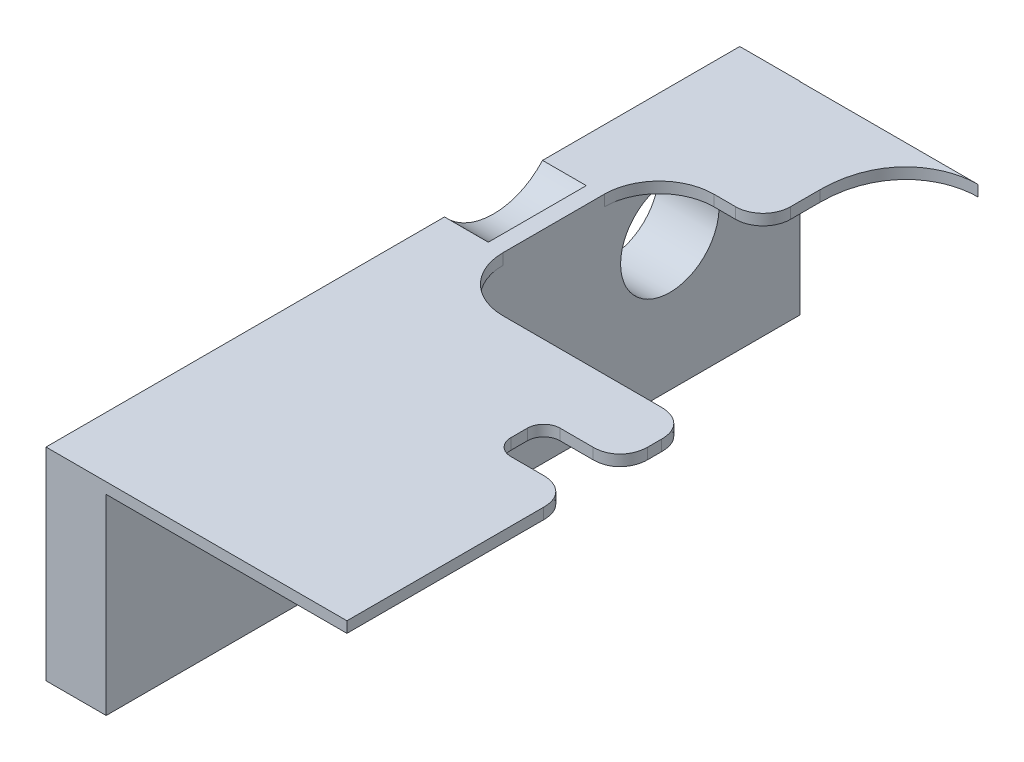
ISO-10303-21;
HEADER;
FILE_DESCRIPTION(('STEP AP214'),'2;1');
FILE_NAME('part.step','',(''),(''),'','','');
FILE_SCHEMA(('AUTOMOTIVE_DESIGN { 1 0 10303 214 1 1 1 1 }'));
ENDSEC;
DATA;
#1=APPLICATION_CONTEXT('core data for automotive mechanical design processes');
#2=APPLICATION_PROTOCOL_DEFINITION('international standard','automotive_design',2000,#1);
#3=PRODUCT_CONTEXT('',#1,'mechanical');
#4=PRODUCT('Part','Part','',(#3));
#5=PRODUCT_RELATED_PRODUCT_CATEGORY('part','',(#4));
#6=PRODUCT_DEFINITION_FORMATION('','',#4);
#7=PRODUCT_DEFINITION_CONTEXT('part definition',#1,'design');
#8=PRODUCT_DEFINITION('design','',#6,#7);
#9=PRODUCT_DEFINITION_SHAPE('','',#8);
#10=(LENGTH_UNIT() NAMED_UNIT(*) SI_UNIT(.MILLI.,.METRE.));
#11=(NAMED_UNIT(*) PLANE_ANGLE_UNIT() SI_UNIT($,.RADIAN.));
#12=(NAMED_UNIT(*) SI_UNIT($,.STERADIAN.) SOLID_ANGLE_UNIT());
#13=UNCERTAINTY_MEASURE_WITH_UNIT(LENGTH_MEASURE(1.E-05),#10,'distance_accuracy_value','');
#14=(GEOMETRIC_REPRESENTATION_CONTEXT(3) GLOBAL_UNCERTAINTY_ASSIGNED_CONTEXT((#13)) GLOBAL_UNIT_ASSIGNED_CONTEXT((#10,
#11,#12)) REPRESENTATION_CONTEXT('',''));
#15=CARTESIAN_POINT('',(0.,0.,0.));
#16=DIRECTION('',(0.,0.,1.));
#17=DIRECTION('',(1.,0.,0.));
#18=AXIS2_PLACEMENT_3D('',#15,#16,#17);
#19=CARTESIAN_POINT('',(8.5,0.,0.));
#20=DIRECTION('',(1.,0.,0.));
#21=DIRECTION('',(0.,0.,1.));
#22=AXIS2_PLACEMENT_3D('',#19,#20,#21);
#23=PLANE('',#22);
#24=DIRECTION('',(0.,0.,1.));
#25=VECTOR('',#24,1.);
#26=CARTESIAN_POINT('',(8.5,-28.5,0.));
#27=LINE('',#26,#25);
#28=CARTESIAN_POINT('',(8.5,-28.5,24.2019318721898));
#29=VERTEX_POINT('',#28);
#30=CARTESIAN_POINT('',(8.5,-28.5,26.7691840241398));
#31=VERTEX_POINT('',#30);
#32=EDGE_CURVE('E301',#29,#31,#27,.T.);
#33=ORIENTED_EDGE('',*,*,#32,.F.);
#34=DIRECTION('',(0.,1.,0.));
#35=VECTOR('',#34,1.);
#36=CARTESIAN_POINT('',(8.5,-36.5,24.2019318721898));
#37=LINE('',#36,#35);
#38=CARTESIAN_POINT('',(8.5,-26.5,24.2019318721898));
#39=VERTEX_POINT('',#38);
#40=EDGE_CURVE('E222',#29,#39,#37,.T.);
#41=ORIENTED_EDGE('',*,*,#40,.T.);
#42=DIRECTION('',(0.,0.,1.));
#43=VECTOR('',#42,1.);
#44=CARTESIAN_POINT('',(8.5,-26.5,-66.7628469614296));
#45=LINE('',#44,#43);
#46=CARTESIAN_POINT('',(8.5,-26.5,26.7691840241398));
#47=VERTEX_POINT('',#46);
#48=EDGE_CURVE('E221',#39,#47,#45,.T.);
#49=ORIENTED_EDGE('',*,*,#48,.T.);
#50=DIRECTION('',(0.,1.,0.));
#51=VECTOR('',#50,1.);
#52=CARTESIAN_POINT('',(8.5,-36.5,26.7691840241398));
#53=LINE('',#52,#51);
#54=EDGE_CURVE('E554',#31,#47,#53,.T.);
#55=ORIENTED_EDGE('',*,*,#54,.F.);
#56=EDGE_LOOP('',(#33,#41,#49,#55));
#57=FACE_BOUND('',#56,.T.);
#58=ADVANCED_FACE('F39',(#57),#23,.T.);
#59=CARTESIAN_POINT('',(-35.5,-36.5,19.2019318721898));
#60=DIRECTION('',(0.,0.,1.));
#61=DIRECTION('',(1.,0.,0.));
#62=AXIS2_PLACEMENT_3D('',#59,#60,#61);
#63=PLANE('',#62);
#64=DIRECTION('',(0.,1.,0.));
#65=VECTOR('',#64,1.);
#66=CARTESIAN_POINT('',(3.5,-36.5,19.2019318721898));
#67=LINE('',#66,#65);
#68=CARTESIAN_POINT('',(3.5,-28.5,19.2019318721898));
#69=VERTEX_POINT('',#68);
#70=CARTESIAN_POINT('',(3.5,-26.5,19.2019318721898));
#71=VERTEX_POINT('',#70);
#72=EDGE_CURVE('E11',#69,#71,#67,.T.);
#73=ORIENTED_EDGE('',*,*,#72,.F.);
#74=DIRECTION('',(-1.,0.,0.));
#75=VECTOR('',#74,1.);
#76=CARTESIAN_POINT('',(17.,-28.5,19.2019318721898));
#77=LINE('',#76,#75);
#78=CARTESIAN_POINT('',(-25.5,-28.5,19.2019318721898));
#79=VERTEX_POINT('',#78);
#80=EDGE_CURVE('E229',#69,#79,#77,.T.);
#81=ORIENTED_EDGE('',*,*,#80,.T.);
#82=DIRECTION('',(0.,1.,0.));
#83=VECTOR('',#82,1.);
#84=CARTESIAN_POINT('',(-25.5,-26.5,19.2019318721898));
#85=LINE('',#84,#83);
#86=CARTESIAN_POINT('',(-25.5,-26.5,19.2019318721898));
#87=VERTEX_POINT('',#86);
#88=EDGE_CURVE('E228',#79,#87,#85,.T.);
#89=ORIENTED_EDGE('',*,*,#88,.T.);
#90=DIRECTION('',(1.,0.,0.));
#91=VECTOR('',#90,1.);
#92=CARTESIAN_POINT('',(-35.5,-26.5,19.2019318721898));
#93=LINE('',#92,#91);
#94=EDGE_CURVE('E220',#87,#71,#93,.T.);
#95=ORIENTED_EDGE('',*,*,#94,.T.);
#96=EDGE_LOOP('',(#73,#81,#89,#95));
#97=FACE_BOUND('',#96,.T.);
#98=ADVANCED_FACE('F226',(#97),#63,.F.);
#99=CARTESIAN_POINT('',(17.,-28.5,40.7691840241398));
#100=DIRECTION('',(0.,0.,1.));
#101=DIRECTION('',(-1.,0.,0.));
#102=AXIS2_PLACEMENT_3D('',#99,#100,#101);
#103=PLANE('',#102);
#104=DIRECTION('',(0.,1.,0.));
#105=VECTOR('',#104,1.);
#106=CARTESIAN_POINT('',(3.5,-36.5,40.7691840241398));
#107=LINE('',#106,#105);
#108=CARTESIAN_POINT('',(3.5,-28.5,40.7691840241398));
#109=VERTEX_POINT('',#108);
#110=CARTESIAN_POINT('',(3.5,-26.5,40.7691840241398));
#111=VERTEX_POINT('',#110);
#112=EDGE_CURVE('E368',#109,#111,#107,.T.);
#113=ORIENTED_EDGE('',*,*,#112,.F.);
#114=DIRECTION('',(-1.,0.,0.));
#115=VECTOR('',#114,1.);
#116=CARTESIAN_POINT('',(17.,-28.5,40.7691840241398));
#117=LINE('',#116,#115);
#118=CARTESIAN_POINT('',(-2.49999999999998,-28.5,40.7691840241398));
#119=VERTEX_POINT('',#118);
#120=EDGE_CURVE('E296',#109,#119,#117,.T.);
#121=ORIENTED_EDGE('',*,*,#120,.T.);
#122=DIRECTION('',(0.,1.,0.));
#123=VECTOR('',#122,1.);
#124=CARTESIAN_POINT('',(-2.49999999999998,-36.5,40.7691840241398));
#125=LINE('',#124,#123);
#126=CARTESIAN_POINT('',(-2.49999999999998,-26.5,40.7691840241398));
#127=VERTEX_POINT('',#126);
#128=EDGE_CURVE('E376',#119,#127,#125,.T.);
#129=ORIENTED_EDGE('',*,*,#128,.T.);
#130=DIRECTION('',(-1.,0.,0.));
#131=VECTOR('',#130,1.);
#132=CARTESIAN_POINT('',(17.,-26.5,40.7691840241398));
#133=LINE('',#132,#131);
#134=EDGE_CURVE('E260',#111,#127,#133,.T.);
#135=ORIENTED_EDGE('',*,*,#134,.F.);
#136=EDGE_LOOP('',(#113,#121,#129,#135));
#137=FACE_BOUND('',#136,.T.);
#138=ADVANCED_FACE('F446',(#137),#103,.F.);
#139=DIRECTION('',(0.,0.,-1.));
#140=VECTOR('',#139,1.);
#141=CARTESIAN_POINT('',(8.5,-28.5,0.));
#142=LINE('',#141,#140);
#143=CARTESIAN_POINT('',(8.5,-28.5,81.7371530385704));
#144=VERTEX_POINT('',#143);
#145=CARTESIAN_POINT('',(8.5,-28.5,45.7691840241398));
#146=VERTEX_POINT('',#145);
#147=EDGE_CURVE('E300',#144,#146,#142,.T.);
#148=ORIENTED_EDGE('',*,*,#147,.T.);
#149=DIRECTION('',(0.,1.,0.));
#150=VECTOR('',#149,1.);
#151=CARTESIAN_POINT('',(8.5,-36.5,45.7691840241398));
#152=LINE('',#151,#150);
#153=CARTESIAN_POINT('',(8.5,-26.5,45.7691840241398));
#154=VERTEX_POINT('',#153);
#155=EDGE_CURVE('E346',#146,#154,#152,.T.);
#156=ORIENTED_EDGE('',*,*,#155,.T.);
#157=CARTESIAN_POINT('',(8.5,-26.5,81.7371530385704));
#158=VERTEX_POINT('',#157);
#159=EDGE_CURVE('E246',#154,#158,#45,.T.);
#160=ORIENTED_EDGE('',*,*,#159,.T.);
#161=DIRECTION('',(0.,1.,0.));
#162=VECTOR('',#161,1.);
#163=CARTESIAN_POINT('',(8.5,-28.5,81.7371530385704));
#164=LINE('',#163,#162);
#165=EDGE_CURVE('E290',#144,#158,#164,.T.);
#166=ORIENTED_EDGE('',*,*,#165,.F.);
#167=EDGE_LOOP('',(#148,#156,#160,#166));
#168=FACE_BOUND('',#167,.T.);
#169=ADVANCED_FACE('F476',(#168),#23,.T.);
#170=CARTESIAN_POINT('',(17.,-28.5,0.));
#171=DIRECTION('',(0.,-1.,0.));
#172=DIRECTION('',(0.,0.,-1.));
#173=AXIS2_PLACEMENT_3D('',#170,#171,#172);
#174=PLANE('',#173);
#175=DIRECTION('',(0.,0.,-1.));
#176=VECTOR('',#175,1.);
#177=CARTESIAN_POINT('',(-16.5,-28.5,0.));
#178=LINE('',#177,#176);
#179=CARTESIAN_POINT('',(-16.5,-28.5,-24.3207797696685));
#180=VERTEX_POINT('',#179);
#181=CARTESIAN_POINT('',(-16.5,-28.5,-29.748719430866));
#182=VERTEX_POINT('',#181);
#183=EDGE_CURVE('E509',#180,#182,#178,.T.);
#184=ORIENTED_EDGE('',*,*,#183,.F.);
#185=CARTESIAN_POINT('',(-21.5,-28.5,-24.3207797696685));
#186=DIRECTION('',(0.,-1.,0.));
#187=DIRECTION('',(0.,0.,-1.));
#188=AXIS2_PLACEMENT_3D('',#185,#186,#187);
#189=CIRCLE('',#188,5.);
#190=CARTESIAN_POINT('',(-21.5,-28.5,-19.3207797696685));
#191=VERTEX_POINT('',#190);
#192=EDGE_CURVE('E507',#180,#191,#189,.T.);
#193=ORIENTED_EDGE('',*,*,#192,.T.);
#194=DIRECTION('',(1.,0.,0.));
#195=VECTOR('',#194,1.);
#196=CARTESIAN_POINT('',(17.,-28.5,-19.3207797696685));
#197=LINE('',#196,#195);
#198=CARTESIAN_POINT('',(-25.5,-28.5,-19.3207797696685));
#199=VERTEX_POINT('',#198);
#200=EDGE_CURVE('E230',#199,#191,#197,.T.);
#201=ORIENTED_EDGE('',*,*,#200,.F.);
#202=CARTESIAN_POINT('',(-25.5,-28.5,-9.32077976966851));
#203=DIRECTION('',(0.,-1.,0.));
#204=DIRECTION('',(0.,0.,-1.));
#205=AXIS2_PLACEMENT_3D('',#202,#203,#204);
#206=CIRCLE('',#205,10.);
#207=CARTESIAN_POINT('',(-35.5,-28.5,-9.32077976966851));
#208=VERTEX_POINT('',#207);
#209=EDGE_CURVE('E324',#199,#208,#206,.F.);
#210=ORIENTED_EDGE('',*,*,#209,.T.);
#211=DIRECTION('',(0.,0.,1.));
#212=VECTOR('',#211,1.);
#213=CARTESIAN_POINT('',(-35.5,-28.5,0.));
#214=LINE('',#213,#212);
#215=CARTESIAN_POINT('',(-35.5,-28.5,-45.));
#216=VERTEX_POINT('',#215);
#217=EDGE_CURVE('E305',#216,#208,#214,.T.);
#218=ORIENTED_EDGE('',*,*,#217,.F.);
#219=DIRECTION('',(1.,0.,0.));
#220=VECTOR('',#219,1.);
#221=CARTESIAN_POINT('',(-40.5,-28.5,-45.));
#222=LINE('',#221,#220);
#223=CARTESIAN_POINT('',(-2.8977037007898,-28.5,-45.));
#224=VERTEX_POINT('',#223);
#225=EDGE_CURVE('E303',#216,#224,#222,.T.);
#226=ORIENTED_EDGE('',*,*,#225,.T.);
#227=CARTESIAN_POINT('',(-16.5,-28.5,-29.748719430866));
#228=CARTESIAN_POINT('',(-16.5,-28.5,-40.0139435271604));
#229=CARTESIAN_POINT('',(-9.64753419036475,-28.5,-45.));
#230=CARTESIAN_POINT('',(-2.8977037007898,-28.5,-45.));
#231=B_SPLINE_CURVE_WITH_KNOTS('',3,(#227,#228,#229,#230),.UNSPECIFIED.,.F.,.F.,(4,4),(0.,1.),.UNSPECIFIED.);
#232=EDGE_CURVE('E389',#182,#224,#231,.T.);
#233=ORIENTED_EDGE('',*,*,#232,.F.);
#234=EDGE_LOOP('',(#184,#193,#201,#210,#218,#226,#233));
#235=FACE_BOUND('',#234,.T.);
#236=ADVANCED_FACE('F453',(#235),#174,.T.);
#237=CARTESIAN_POINT('',(8.5,-26.5,-66.7628469614296));
#238=DIRECTION('',(0.,-1.,0.));
#239=DIRECTION('',(0.,0.,-1.));
#240=AXIS2_PLACEMENT_3D('',#237,#238,#239);
#241=PLANE('',#240);
#242=ORIENTED_EDGE('',*,*,#48,.F.);
#243=CARTESIAN_POINT('',(3.5,-26.5,19.2019318721898));
#244=CARTESIAN_POINT('',(5.85702260395516,-26.5,19.2019318721898));
#245=CARTESIAN_POINT('',(8.50000000000001,-26.5,20.7285626503232));
#246=CARTESIAN_POINT('',(8.5,-26.5,24.2019318721898));
#247=B_SPLINE_CURVE_WITH_KNOTS('',3,(#243,#244,#245,#246),.UNSPECIFIED.,.F.,.F.,(4,4),(0.,1.),.UNSPECIFIED.);
#248=EDGE_CURVE('E211',#71,#39,#247,.T.);
#249=ORIENTED_EDGE('',*,*,#248,.F.);
#250=ORIENTED_EDGE('',*,*,#94,.F.);
#251=CARTESIAN_POINT('',(-25.5,-26.5,9.2019318721898));
#252=DIRECTION('',(0.,-1.,0.));
#253=DIRECTION('',(0.,0.,-1.));
#254=AXIS2_PLACEMENT_3D('',#251,#252,#253);
#255=CIRCLE('',#254,10.);
#256=CARTESIAN_POINT('',(-35.5,-26.5,9.2019318721898));
#257=VERTEX_POINT('',#256);
#258=EDGE_CURVE('E311',#87,#257,#255,.T.);
#259=ORIENTED_EDGE('',*,*,#258,.T.);
#260=DIRECTION('',(0.,0.,-1.));
#261=VECTOR('',#260,1.);
#262=CARTESIAN_POINT('',(-35.5,-26.5,5.));
#263=LINE('',#262,#261);
#264=CARTESIAN_POINT('',(-35.5,-26.5,-9.32077976966851));
#265=VERTEX_POINT('',#264);
#266=EDGE_CURVE('E251',#257,#265,#263,.T.);
#267=ORIENTED_EDGE('',*,*,#266,.T.);
#268=CARTESIAN_POINT('',(-25.5,-26.5,-9.32077976966851));
#269=DIRECTION('',(0.,-1.,0.));
#270=DIRECTION('',(0.,0.,-1.));
#271=AXIS2_PLACEMENT_3D('',#268,#269,#270);
#272=CIRCLE('',#271,10.);
#273=CARTESIAN_POINT('',(-25.5,-26.5,-19.3207797696685));
#274=VERTEX_POINT('',#273);
#275=EDGE_CURVE('E321',#265,#274,#272,.T.);
#276=ORIENTED_EDGE('',*,*,#275,.T.);
#277=DIRECTION('',(-1.,0.,0.));
#278=VECTOR('',#277,1.);
#279=CARTESIAN_POINT('',(1.5,-26.5,-19.3207797696685));
#280=LINE('',#279,#278);
#281=CARTESIAN_POINT('',(-21.5,-26.5,-19.3207797696685));
#282=VERTEX_POINT('',#281);
#283=EDGE_CURVE('E235',#282,#274,#280,.T.);
#284=ORIENTED_EDGE('',*,*,#283,.F.);
#285=CARTESIAN_POINT('',(-21.5,-26.5,-24.3207797696685));
#286=DIRECTION('',(0.,1.,0.));
#287=DIRECTION('',(0.,0.,1.));
#288=AXIS2_PLACEMENT_3D('',#285,#286,#287);
#289=CIRCLE('',#288,5.);
#290=CARTESIAN_POINT('',(-16.5,-26.5,-24.3207797696685));
#291=VERTEX_POINT('',#290);
#292=EDGE_CURVE('E405',#282,#291,#289,.T.);
#293=ORIENTED_EDGE('',*,*,#292,.T.);
#294=DIRECTION('',(0.,0.,1.));
#295=VECTOR('',#294,1.);
#296=CARTESIAN_POINT('',(-16.5,-26.5,0.));
#297=LINE('',#296,#295);
#298=CARTESIAN_POINT('',(-16.5,-26.5,-29.748719430866));
#299=VERTEX_POINT('',#298);
#300=EDGE_CURVE('E516',#299,#291,#297,.T.);
#301=ORIENTED_EDGE('',*,*,#300,.F.);
#302=CARTESIAN_POINT('',(-16.5,-26.5,-29.748719430866));
#303=CARTESIAN_POINT('',(-16.5,-26.5,-40.0139435271604));
#304=CARTESIAN_POINT('',(-9.64753419036475,-26.5,-45.));
#305=CARTESIAN_POINT('',(-2.8977037007898,-26.5,-45.));
#306=B_SPLINE_CURVE_WITH_KNOTS('',3,(#302,#303,#304,#305),.UNSPECIFIED.,.F.,.F.,(4,4),(0.,1.),.UNSPECIFIED.);
#307=CARTESIAN_POINT('',(-2.8977037007898,-26.5,-45.));
#308=VERTEX_POINT('',#307);
#309=EDGE_CURVE('E379',#299,#308,#306,.T.);
#310=ORIENTED_EDGE('',*,*,#309,.T.);
#311=DIRECTION('',(1.,0.,0.));
#312=VECTOR('',#311,1.);
#313=CARTESIAN_POINT('',(-40.5,-26.5,-45.));
#314=LINE('',#313,#312);
#315=CARTESIAN_POINT('',(-35.5,-26.5,-45.));
#316=VERTEX_POINT('',#315);
#317=EDGE_CURVE('E254',#316,#308,#314,.T.);
#318=ORIENTED_EDGE('',*,*,#317,.F.);
#319=CARTESIAN_POINT('',(-35.5,-26.5,-45.0594239487394));
#320=VERTEX_POINT('',#319);
#321=EDGE_CURVE('E255',#316,#320,#263,.T.);
#322=ORIENTED_EDGE('',*,*,#321,.T.);
#323=DIRECTION('',(1.,0.,0.));
#324=VECTOR('',#323,1.);
#325=CARTESIAN_POINT('',(-35.5,-26.5,-45.0594239487394));
#326=LINE('',#325,#324);
#327=CARTESIAN_POINT('',(-46.5,-26.5,-45.0594239487394));
#328=VERTEX_POINT('',#327);
#329=EDGE_CURVE('E257',#328,#320,#326,.T.);
#330=ORIENTED_EDGE('',*,*,#329,.F.);
#331=DIRECTION('',(0.,0.,1.));
#332=VECTOR('',#331,1.);
#333=CARTESIAN_POINT('',(-46.5,-26.5,-66.7628469614296));
#334=LINE('',#333,#332);
#335=CARTESIAN_POINT('',(-46.5,-26.5,-9.01082936654833));
#336=VERTEX_POINT('',#335);
#337=EDGE_CURVE('E249',#328,#336,#334,.T.);
#338=ORIENTED_EDGE('',*,*,#337,.T.);
#339=DIRECTION('',(-1.,0.,0.));
#340=VECTOR('',#339,1.);
#341=CARTESIAN_POINT('',(-38.5,-26.5,-9.01082936654833));
#342=LINE('',#341,#340);
#343=CARTESIAN_POINT('',(-38.5,-26.5,-9.01082936654833));
#344=VERTEX_POINT('',#343);
#345=EDGE_CURVE('E329',#336,#344,#342,.F.);
#346=ORIENTED_EDGE('',*,*,#345,.T.);
#347=DIRECTION('',(0.,0.,-1.));
#348=VECTOR('',#347,1.);
#349=CARTESIAN_POINT('',(-38.5,-26.5,-66.7628469614296));
#350=LINE('',#349,#348);
#351=CARTESIAN_POINT('',(-38.5,-26.5,8.90234727253723));
#352=VERTEX_POINT('',#351);
#353=EDGE_CURVE('E327',#352,#344,#350,.T.);
#354=ORIENTED_EDGE('',*,*,#353,.F.);
#355=DIRECTION('',(-1.,0.,0.));
#356=VECTOR('',#355,1.);
#357=CARTESIAN_POINT('',(-38.5,-26.5,8.90234727253723));
#358=LINE('',#357,#356);
#359=CARTESIAN_POINT('',(-46.5,-26.5,8.90234727253723));
#360=VERTEX_POINT('',#359);
#361=EDGE_CURVE('E332',#352,#360,#358,.T.);
#362=ORIENTED_EDGE('',*,*,#361,.T.);
#363=CARTESIAN_POINT('',(-46.5,-26.5,81.7371530385704));
#364=VERTEX_POINT('',#363);
#365=EDGE_CURVE('E247',#360,#364,#334,.T.);
#366=ORIENTED_EDGE('',*,*,#365,.T.);
#367=DIRECTION('',(-1.,0.,0.));
#368=VECTOR('',#367,1.);
#369=CARTESIAN_POINT('',(8.5,-26.5,81.7371530385704));
#370=LINE('',#369,#368);
#371=EDGE_CURVE('E243',#158,#364,#370,.T.);
#372=ORIENTED_EDGE('',*,*,#371,.F.);
#373=ORIENTED_EDGE('',*,*,#159,.F.);
#374=CARTESIAN_POINT('',(3.5,-26.5,40.7691840241398));
#375=CARTESIAN_POINT('',(5.85702260395516,-26.5,40.7691840241398));
#376=CARTESIAN_POINT('',(8.50000000000001,-26.5,42.2958148022733));
#377=CARTESIAN_POINT('',(8.5,-26.5,45.7691840241398));
#378=B_SPLINE_CURVE_WITH_KNOTS('',3,(#374,#375,#376,#377),.UNSPECIFIED.,.F.,.F.,(4,4),(0.,1.),.UNSPECIFIED.);
#379=EDGE_CURVE('E534',#111,#154,#378,.T.);
#380=ORIENTED_EDGE('',*,*,#379,.F.);
#381=ORIENTED_EDGE('',*,*,#134,.T.);
#382=CARTESIAN_POINT('',(-2.5,-26.5,37.7691840241398));
#383=DIRECTION('',(0.,1.,0.));
#384=DIRECTION('',(0.,0.,1.));
#385=AXIS2_PLACEMENT_3D('',#382,#383,#384);
#386=CIRCLE('',#385,3.);
#387=CARTESIAN_POINT('',(-5.5,-26.5,37.7691840241398));
#388=VERTEX_POINT('',#387);
#389=EDGE_CURVE('E366',#127,#388,#386,.F.);
#390=ORIENTED_EDGE('',*,*,#389,.T.);
#391=DIRECTION('',(0.,0.,1.));
#392=VECTOR('',#391,1.);
#393=CARTESIAN_POINT('',(-5.5,-26.5,0.));
#394=LINE('',#393,#392);
#395=CARTESIAN_POINT('',(-5.5,-26.5,34.7691840241399));
#396=VERTEX_POINT('',#395);
#397=EDGE_CURVE('E361',#396,#388,#394,.T.);
#398=ORIENTED_EDGE('',*,*,#397,.F.);
#399=CARTESIAN_POINT('',(-2.5,-26.5,34.7691840241398));
#400=DIRECTION('',(0.,1.,0.));
#401=DIRECTION('',(0.,0.,1.));
#402=AXIS2_PLACEMENT_3D('',#399,#400,#401);
#403=CIRCLE('',#402,3.);
#404=CARTESIAN_POINT('',(-2.49999999999998,-26.5,31.7691840241398));
#405=VERTEX_POINT('',#404);
#406=EDGE_CURVE('E358',#405,#396,#403,.T.);
#407=ORIENTED_EDGE('',*,*,#406,.F.);
#408=DIRECTION('',(1.,0.,0.));
#409=VECTOR('',#408,1.);
#410=CARTESIAN_POINT('',(3.5,-26.5,31.7691840241398));
#411=LINE('',#410,#409);
#412=CARTESIAN_POINT('',(3.5,-26.5,31.7691840241398));
#413=VERTEX_POINT('',#412);
#414=EDGE_CURVE('E232',#405,#413,#411,.T.);
#415=ORIENTED_EDGE('',*,*,#414,.T.);
#416=CARTESIAN_POINT('',(8.5,-26.5,26.7691840241398));
#417=CARTESIAN_POINT('',(8.49999999999999,-26.5,29.126206628095));
#418=CARTESIAN_POINT('',(6.97336922186657,-26.5,31.7691840241398));
#419=CARTESIAN_POINT('',(3.5,-26.5,31.7691840241398));
#420=B_SPLINE_CURVE_WITH_KNOTS('',3,(#416,#417,#418,#419),.UNSPECIFIED.,.F.,.F.,(4,4),(0.,1.),.UNSPECIFIED.);
#421=EDGE_CURVE('E61',#47,#413,#420,.T.);
#422=ORIENTED_EDGE('',*,*,#421,.F.);
#423=EDGE_LOOP('',(#242,#249,#250,#259,#267,#276,#284,#293,#301,#310,#318,#322,#330,#338,#346,
#354,#362,#366,#372,#373,#380,#381,#390,#398,#407,#415,#422));
#424=FACE_BOUND('',#423,.T.);
#425=ADVANCED_FACE('F219',(#424),#241,.F.);
#426=CARTESIAN_POINT('',(-35.5,-23.5,-45.0594239487394));
#427=DIRECTION('',(0.,0.,-1.));
#428=DIRECTION('',(1.,0.,0.));
#429=AXIS2_PLACEMENT_3D('',#426,#427,#428);
#430=PLANE('',#429);
#431=ORIENTED_EDGE('',*,*,#329,.T.);
#432=DIRECTION('',(0.,1.,0.));
#433=VECTOR('',#432,1.);
#434=CARTESIAN_POINT('',(-35.5,-23.5,-45.0594239487394));
#435=LINE('',#434,#433);
#436=CARTESIAN_POINT('',(-35.5,-63.5,-45.0594239487394));
#437=VERTEX_POINT('',#436);
#438=EDGE_CURVE('E276',#437,#320,#435,.T.);
#439=ORIENTED_EDGE('',*,*,#438,.F.);
#440=DIRECTION('',(-1.,0.,0.));
#441=VECTOR('',#440,1.);
#442=CARTESIAN_POINT('',(-35.5,-63.5,-45.0594239487394));
#443=LINE('',#442,#441);
#444=CARTESIAN_POINT('',(-46.5,-63.5,-45.0594239487394));
#445=VERTEX_POINT('',#444);
#446=EDGE_CURVE('E265',#437,#445,#443,.T.);
#447=ORIENTED_EDGE('',*,*,#446,.T.);
#448=DIRECTION('',(0.,1.,0.));
#449=VECTOR('',#448,1.);
#450=CARTESIAN_POINT('',(-46.5,-23.5,-45.0594239487394));
#451=LINE('',#450,#449);
#452=EDGE_CURVE('E270',#445,#328,#451,.T.);
#453=ORIENTED_EDGE('',*,*,#452,.T.);
#454=EDGE_LOOP('',(#431,#439,#447,#453));
#455=FACE_BOUND('',#454,.T.);
#456=ADVANCED_FACE('F452',(#455),#430,.T.);
#457=CARTESIAN_POINT('',(3.5,-28.5,19.2019318721898));
#458=CARTESIAN_POINT('',(5.85702260395516,-28.5,19.2019318721898));
#459=CARTESIAN_POINT('',(8.50000000000001,-28.5,20.7285626503232));
#460=CARTESIAN_POINT('',(8.5,-28.5,24.2019318721898));
#461=B_SPLINE_CURVE_WITH_KNOTS('',3,(#457,#458,#459,#460),.UNSPECIFIED.,.F.,.F.,(4,4),(0.,1.),.UNSPECIFIED.);
#462=EDGE_CURVE('E53',#29,#69,#461,.F.);
#463=ORIENTED_EDGE('',*,*,#462,.F.);
#464=ORIENTED_EDGE('',*,*,#32,.T.);
#465=CARTESIAN_POINT('',(8.5,-28.5,26.7691840241398));
#466=CARTESIAN_POINT('',(8.49999999999999,-28.5,29.126206628095));
#467=CARTESIAN_POINT('',(6.97336922186657,-28.5,31.7691840241398));
#468=CARTESIAN_POINT('',(3.5,-28.5,31.7691840241398));
#469=B_SPLINE_CURVE_WITH_KNOTS('',3,(#465,#466,#467,#468),.UNSPECIFIED.,.F.,.F.,(4,4),(0.,1.),.UNSPECIFIED.);
#470=CARTESIAN_POINT('',(3.5,-28.5,31.7691840241398));
#471=VERTEX_POINT('',#470);
#472=EDGE_CURVE('E551',#471,#31,#469,.F.);
#473=ORIENTED_EDGE('',*,*,#472,.F.);
#474=DIRECTION('',(-1.,0.,0.));
#475=VECTOR('',#474,1.);
#476=CARTESIAN_POINT('',(17.,-28.5,31.7691840241398));
#477=LINE('',#476,#475);
#478=CARTESIAN_POINT('',(-2.49999999999998,-28.5,31.7691840241398));
#479=VERTEX_POINT('',#478);
#480=EDGE_CURVE('E241',#471,#479,#477,.T.);
#481=ORIENTED_EDGE('',*,*,#480,.T.);
#482=CARTESIAN_POINT('',(-2.5,-28.5,34.7691840241398));
#483=DIRECTION('',(0.,-1.,0.));
#484=DIRECTION('',(0.,0.,-1.));
#485=AXIS2_PLACEMENT_3D('',#482,#483,#484);
#486=CIRCLE('',#485,3.);
#487=CARTESIAN_POINT('',(-5.5,-28.5,34.7691840241399));
#488=VERTEX_POINT('',#487);
#489=EDGE_CURVE('E338',#488,#479,#486,.T.);
#490=ORIENTED_EDGE('',*,*,#489,.F.);
#491=DIRECTION('',(0.,0.,-1.));
#492=VECTOR('',#491,1.);
#493=CARTESIAN_POINT('',(-5.5,-28.5,0.));
#494=LINE('',#493,#492);
#495=CARTESIAN_POINT('',(-5.5,-28.5,37.7691840241398));
#496=VERTEX_POINT('',#495);
#497=EDGE_CURVE('E341',#496,#488,#494,.T.);
#498=ORIENTED_EDGE('',*,*,#497,.F.);
#499=CARTESIAN_POINT('',(-2.5,-28.5,37.7691840241398));
#500=DIRECTION('',(0.,-1.,0.));
#501=DIRECTION('',(0.,0.,-1.));
#502=AXIS2_PLACEMENT_3D('',#499,#500,#501);
#503=CIRCLE('',#502,3.);
#504=EDGE_CURVE('E343',#496,#119,#503,.F.);
#505=ORIENTED_EDGE('',*,*,#504,.T.);
#506=ORIENTED_EDGE('',*,*,#120,.F.);
#507=CARTESIAN_POINT('',(3.5,-28.5,40.7691840241398));
#508=CARTESIAN_POINT('',(5.85702260395516,-28.5,40.7691840241398));
#509=CARTESIAN_POINT('',(8.50000000000001,-28.5,42.2958148022733));
#510=CARTESIAN_POINT('',(8.5,-28.5,45.7691840241398));
#511=B_SPLINE_CURVE_WITH_KNOTS('',3,(#507,#508,#509,#510),.UNSPECIFIED.,.F.,.F.,(4,4),(0.,1.),.UNSPECIFIED.);
#512=EDGE_CURVE('E364',#146,#109,#511,.F.);
#513=ORIENTED_EDGE('',*,*,#512,.F.);
#514=ORIENTED_EDGE('',*,*,#147,.F.);
#515=DIRECTION('',(-1.,0.,0.));
#516=VECTOR('',#515,1.);
#517=CARTESIAN_POINT('',(-40.5,-28.5,81.7371530385704));
#518=LINE('',#517,#516);
#519=CARTESIAN_POINT('',(-35.5,-28.5,81.7371530385704));
#520=VERTEX_POINT('',#519);
#521=EDGE_CURVE('E287',#144,#520,#518,.T.);
#522=ORIENTED_EDGE('',*,*,#521,.T.);
#523=DIRECTION('',(0.,0.,-1.));
#524=VECTOR('',#523,1.);
#525=CARTESIAN_POINT('',(-35.5,-28.5,0.));
#526=LINE('',#525,#524);
#527=CARTESIAN_POINT('',(-35.5,-28.5,9.2019318721898));
#528=VERTEX_POINT('',#527);
#529=EDGE_CURVE('E293',#520,#528,#526,.T.);
#530=ORIENTED_EDGE('',*,*,#529,.T.);
#531=CARTESIAN_POINT('',(-25.5,-28.5,9.2019318721898));
#532=DIRECTION('',(0.,-1.,0.));
#533=DIRECTION('',(0.,0.,-1.));
#534=AXIS2_PLACEMENT_3D('',#531,#532,#533);
#535=CIRCLE('',#534,10.);
#536=EDGE_CURVE('E313',#528,#79,#535,.F.);
#537=ORIENTED_EDGE('',*,*,#536,.T.);
#538=ORIENTED_EDGE('',*,*,#80,.F.);
#539=EDGE_LOOP('',(#463,#464,#473,#481,#490,#498,#505,#506,#513,#514,#522,#530,#537,#538));
#540=FACE_BOUND('',#539,.T.);
#541=ADVANCED_FACE('F460',(#540),#174,.T.);
#542=CARTESIAN_POINT('',(-40.5,-23.5,-45.));
#543=DIRECTION('',(0.,0.,-1.));
#544=DIRECTION('',(1.,0.,0.));
#545=AXIS2_PLACEMENT_3D('',#542,#543,#544);
#546=PLANE('',#545);
#547=ORIENTED_EDGE('',*,*,#317,.T.);
#548=DIRECTION('',(0.,1.,0.));
#549=VECTOR('',#548,1.);
#550=CARTESIAN_POINT('',(-2.8977037007898,-48.9358514285545,-45.));
#551=LINE('',#550,#549);
#552=EDGE_CURVE('E397',#224,#308,#551,.T.);
#553=ORIENTED_EDGE('',*,*,#552,.F.);
#554=ORIENTED_EDGE('',*,*,#225,.F.);
#555=DIRECTION('',(0.,-1.,0.));
#556=VECTOR('',#555,1.);
#557=CARTESIAN_POINT('',(-35.5,-23.5,-45.));
#558=LINE('',#557,#556);
#559=EDGE_CURVE('E279',#316,#216,#558,.T.);
#560=ORIENTED_EDGE('',*,*,#559,.F.);
#561=EDGE_LOOP('',(#547,#553,#554,#560));
#562=FACE_BOUND('',#561,.T.);
#563=ADVANCED_FACE('F469',(#562),#546,.T.);
#564=CARTESIAN_POINT('',(-40.5,-28.5,81.7371530385704));
#565=DIRECTION('',(0.,0.,1.));
#566=DIRECTION('',(-1.,0.,0.));
#567=AXIS2_PLACEMENT_3D('',#564,#565,#566);
#568=PLANE('',#567);
#569=ORIENTED_EDGE('',*,*,#371,.T.);
#570=DIRECTION('',(0.,-1.,0.));
#571=VECTOR('',#570,1.);
#572=CARTESIAN_POINT('',(-46.5,-23.5,81.7371530385704));
#573=LINE('',#572,#571);
#574=CARTESIAN_POINT('',(-46.5,-63.5,81.7371530385704));
#575=VERTEX_POINT('',#574);
#576=EDGE_CURVE('E284',#364,#575,#573,.T.);
#577=ORIENTED_EDGE('',*,*,#576,.T.);
#578=DIRECTION('',(-1.,0.,0.));
#579=VECTOR('',#578,1.);
#580=CARTESIAN_POINT('',(-35.5,-63.5,81.7371530385704));
#581=LINE('',#580,#579);
#582=CARTESIAN_POINT('',(-35.5,-63.5,81.7371530385704));
#583=VERTEX_POINT('',#582);
#584=EDGE_CURVE('E267',#583,#575,#581,.T.);
#585=ORIENTED_EDGE('',*,*,#584,.F.);
#586=DIRECTION('',(0.,-1.,0.));
#587=VECTOR('',#586,1.);
#588=CARTESIAN_POINT('',(-35.5,-23.5,81.7371530385704));
#589=LINE('',#588,#587);
#590=EDGE_CURVE('E273',#520,#583,#589,.T.);
#591=ORIENTED_EDGE('',*,*,#590,.F.);
#592=ORIENTED_EDGE('',*,*,#521,.F.);
#593=ORIENTED_EDGE('',*,*,#165,.T.);
#594=EDGE_LOOP('',(#569,#577,#585,#591,#592,#593));
#595=FACE_BOUND('',#594,.T.);
#596=ADVANCED_FACE('F466',(#595),#568,.T.);
#597=CARTESIAN_POINT('',(-35.5,-23.5,5.));
#598=DIRECTION('',(-1.,0.,0.));
#599=DIRECTION('',(0.,0.,-1.));
#600=AXIS2_PLACEMENT_3D('',#597,#598,#599);
#601=PLANE('',#600);
#602=CARTESIAN_POINT('',(-35.5,-39.06,-21.2794239487393));
#603=DIRECTION('',(-1.,0.,0.));
#604=DIRECTION('',(0.,0.,1.));
#605=AXIS2_PLACEMENT_3D('',#602,#603,#604);
#606=CIRCLE('',#605,9.);
#607=CARTESIAN_POINT('',(-35.5,-39.06,-12.2794239487393));
#608=VERTEX_POINT('',#607);
#609=EDGE_CURVE('E223',#608,#608,#606,.T.);
#610=ORIENTED_EDGE('',*,*,#609,.T.);
#611=EDGE_LOOP('',(#610));
#612=FACE_BOUND('',#611,.T.);
#613=ORIENTED_EDGE('',*,*,#217,.T.);
#614=DIRECTION('',(0.,1.,0.));
#615=VECTOR('',#614,1.);
#616=CARTESIAN_POINT('',(-35.5,-26.5,-9.32077976966851));
#617=LINE('',#616,#615);
#618=EDGE_CURVE('E316',#208,#265,#617,.T.);
#619=ORIENTED_EDGE('',*,*,#618,.T.);
#620=ORIENTED_EDGE('',*,*,#266,.F.);
#621=DIRECTION('',(0.,1.,0.));
#622=VECTOR('',#621,1.);
#623=CARTESIAN_POINT('',(-35.5,-28.5,9.2019318721898));
#624=LINE('',#623,#622);
#625=EDGE_CURVE('E308',#257,#528,#624,.F.);
#626=ORIENTED_EDGE('',*,*,#625,.T.);
#627=ORIENTED_EDGE('',*,*,#529,.F.);
#628=ORIENTED_EDGE('',*,*,#590,.T.);
#629=DIRECTION('',(0.,0.,1.));
#630=VECTOR('',#629,1.);
#631=CARTESIAN_POINT('',(-35.5,-63.5,81.7371530385704));
#632=LINE('',#631,#630);
#633=EDGE_CURVE('E263',#437,#583,#632,.T.);
#634=ORIENTED_EDGE('',*,*,#633,.F.);
#635=ORIENTED_EDGE('',*,*,#438,.T.);
#636=ORIENTED_EDGE('',*,*,#321,.F.);
#637=ORIENTED_EDGE('',*,*,#559,.T.);
#638=EDGE_LOOP('',(#613,#619,#620,#626,#627,#628,#634,#635,#636,#637));
#639=FACE_BOUND('',#638,.T.);
#640=ADVANCED_FACE('F464',(#612,#639),#601,.F.);
#641=CARTESIAN_POINT('',(-46.5,-18.5,1.38666652696873));
#642=DIRECTION('',(-1.,0.,0.));
#643=DIRECTION('',(0.,0.,-1.));
#644=AXIS2_PLACEMENT_3D('',#641,#642,#643);
#645=PLANE('',#644);
#646=CARTESIAN_POINT('',(-46.5,-39.06,-21.2794239487393));
#647=DIRECTION('',(-1.,0.,0.));
#648=DIRECTION('',(0.,0.,1.));
#649=AXIS2_PLACEMENT_3D('',#646,#647,#648);
#650=CIRCLE('',#649,9.);
#651=CARTESIAN_POINT('',(-46.5,-39.06,-12.2794239487393));
#652=VERTEX_POINT('',#651);
#653=EDGE_CURVE('E993',#652,#652,#650,.T.);
#654=ORIENTED_EDGE('',*,*,#653,.F.);
#655=EDGE_LOOP('',(#654));
#656=FACE_BOUND('',#655,.T.);
#657=CARTESIAN_POINT('',(-46.5,-18.51379153326,-0.0542410470055508));
#658=DIRECTION('',(-1.,0.,0.));
#659=DIRECTION('',(0.,0.,1.));
#660=AXIS2_PLACEMENT_3D('',#657,#658,#659);
#661=CIRCLE('',#660,12.);
#662=EDGE_CURVE('E514',#336,#360,#661,.T.);
#663=ORIENTED_EDGE('',*,*,#662,.F.);
#664=ORIENTED_EDGE('',*,*,#337,.F.);
#665=ORIENTED_EDGE('',*,*,#452,.F.);
#666=DIRECTION('',(0.,0.,1.));
#667=VECTOR('',#666,1.);
#668=CARTESIAN_POINT('',(-46.5,-63.5,81.7371530385704));
#669=LINE('',#668,#667);
#670=EDGE_CURVE('E262',#445,#575,#669,.T.);
#671=ORIENTED_EDGE('',*,*,#670,.T.);
#672=ORIENTED_EDGE('',*,*,#576,.F.);
#673=ORIENTED_EDGE('',*,*,#365,.F.);
#674=EDGE_LOOP('',(#663,#664,#665,#671,#672,#673));
#675=FACE_BOUND('',#674,.T.);
#676=ADVANCED_FACE('F456',(#656,#675),#645,.T.);
#677=CARTESIAN_POINT('',(-35.5,-63.5,81.7371530385704));
#678=DIRECTION('',(0.,1.,0.));
#679=DIRECTION('',(0.,0.,1.));
#680=AXIS2_PLACEMENT_3D('',#677,#678,#679);
#681=PLANE('',#680);
#682=ORIENTED_EDGE('',*,*,#670,.F.);
#683=ORIENTED_EDGE('',*,*,#446,.F.);
#684=ORIENTED_EDGE('',*,*,#633,.T.);
#685=ORIENTED_EDGE('',*,*,#584,.T.);
#686=EDGE_LOOP('',(#682,#683,#684,#685));
#687=FACE_BOUND('',#686,.T.);
#688=ADVANCED_FACE('F449',(#687),#681,.F.);
#689=CARTESIAN_POINT('',(3.5,-34.,31.7691840241398));
#690=DIRECTION('',(0.,0.,-1.));
#691=DIRECTION('',(1.,0.,0.));
#692=AXIS2_PLACEMENT_3D('',#689,#690,#691);
#693=PLANE('',#692);
#694=ORIENTED_EDGE('',*,*,#480,.F.);
#695=DIRECTION('',(0.,1.,0.));
#696=VECTOR('',#695,1.);
#697=CARTESIAN_POINT('',(3.5,-36.5,31.7691840241398));
#698=LINE('',#697,#696);
#699=EDGE_CURVE('E47',#471,#413,#698,.T.);
#700=ORIENTED_EDGE('',*,*,#699,.T.);
#701=ORIENTED_EDGE('',*,*,#414,.F.);
#702=DIRECTION('',(0.,1.,0.));
#703=VECTOR('',#702,1.);
#704=CARTESIAN_POINT('',(-2.49999999999998,-36.5,31.7691840241398));
#705=LINE('',#704,#703);
#706=EDGE_CURVE('E375',#479,#405,#705,.T.);
#707=ORIENTED_EDGE('',*,*,#706,.F.);
#708=EDGE_LOOP('',(#694,#700,#701,#707));
#709=FACE_BOUND('',#708,.T.);
#710=ADVANCED_FACE('F350',(#709),#693,.F.);
#711=CARTESIAN_POINT('',(-25.5,-36.5,9.2019318721898));
#712=DIRECTION('',(0.,-1.,0.));
#713=DIRECTION('',(0.,0.,-1.));
#714=AXIS2_PLACEMENT_3D('',#711,#712,#713);
#715=CYLINDRICAL_SURFACE('',#714,10.);
#716=ORIENTED_EDGE('',*,*,#536,.F.);
#717=ORIENTED_EDGE('',*,*,#625,.F.);
#718=ORIENTED_EDGE('',*,*,#258,.F.);
#719=ORIENTED_EDGE('',*,*,#88,.F.);
#720=EDGE_LOOP('',(#716,#717,#718,#719));
#721=FACE_BOUND('',#720,.T.);
#722=ADVANCED_FACE('F442',(#721),#715,.F.);
#723=CARTESIAN_POINT('',(1.5,-36.5,-19.3207797696685));
#724=DIRECTION('',(0.,0.,-1.));
#725=DIRECTION('',(-1.,0.,0.));
#726=AXIS2_PLACEMENT_3D('',#723,#724,#725);
#727=PLANE('',#726);
#728=ORIENTED_EDGE('',*,*,#200,.T.);
#729=DIRECTION('',(0.,1.,0.));
#730=VECTOR('',#729,1.);
#731=CARTESIAN_POINT('',(-21.5,-36.5,-19.3207797696685));
#732=LINE('',#731,#730);
#733=EDGE_CURVE('E335',#191,#282,#732,.T.);
#734=ORIENTED_EDGE('',*,*,#733,.T.);
#735=ORIENTED_EDGE('',*,*,#283,.T.);
#736=DIRECTION('',(0.,1.,0.));
#737=VECTOR('',#736,1.);
#738=CARTESIAN_POINT('',(-25.5,-28.5,-19.3207797696685));
#739=LINE('',#738,#737);
#740=EDGE_CURVE('E319',#274,#199,#739,.F.);
#741=ORIENTED_EDGE('',*,*,#740,.T.);
#742=EDGE_LOOP('',(#728,#734,#735,#741));
#743=FACE_BOUND('',#742,.T.);
#744=ADVANCED_FACE('F439',(#743),#727,.F.);
#745=CARTESIAN_POINT('',(-25.5,-23.5,-9.32077976966851));
#746=DIRECTION('',(0.,-1.,0.));
#747=DIRECTION('',(0.,0.,-1.));
#748=AXIS2_PLACEMENT_3D('',#745,#746,#747);
#749=CYLINDRICAL_SURFACE('',#748,10.);
#750=ORIENTED_EDGE('',*,*,#209,.F.);
#751=ORIENTED_EDGE('',*,*,#740,.F.);
#752=ORIENTED_EDGE('',*,*,#275,.F.);
#753=ORIENTED_EDGE('',*,*,#618,.F.);
#754=EDGE_LOOP('',(#750,#751,#752,#753));
#755=FACE_BOUND('',#754,.T.);
#756=ADVANCED_FACE('F41',(#755),#749,.F.);
#757=CARTESIAN_POINT('',(-38.5,-18.51379153326,-0.0542410470055508));
#758=DIRECTION('',(-1.,0.,0.));
#759=DIRECTION('',(0.,0.,1.));
#760=AXIS2_PLACEMENT_3D('',#757,#758,#759);
#761=CYLINDRICAL_SURFACE('',#760,12.);
#762=CARTESIAN_POINT('',(-38.5,-18.51379153326,-0.0542410470055508));
#763=DIRECTION('',(-1.,0.,0.));
#764=DIRECTION('',(0.,0.,1.));
#765=AXIS2_PLACEMENT_3D('',#762,#763,#764);
#766=CIRCLE('',#765,12.);
#767=EDGE_CURVE('E519',#344,#352,#766,.T.);
#768=ORIENTED_EDGE('',*,*,#767,.F.);
#769=ORIENTED_EDGE('',*,*,#345,.F.);
#770=ORIENTED_EDGE('',*,*,#662,.T.);
#771=ORIENTED_EDGE('',*,*,#361,.F.);
#772=EDGE_LOOP('',(#768,#769,#770,#771));
#773=FACE_BOUND('',#772,.T.);
#774=ADVANCED_FACE('F434',(#773),#761,.F.);
#775=CARTESIAN_POINT('',(-38.5,-18.51379153326,-0.0542410470055508));
#776=DIRECTION('',(-1.,0.,0.));
#777=DIRECTION('',(0.,0.,1.));
#778=AXIS2_PLACEMENT_3D('',#775,#776,#777);
#779=PLANE('',#778);
#780=ORIENTED_EDGE('',*,*,#353,.T.);
#781=ORIENTED_EDGE('',*,*,#767,.T.);
#782=EDGE_LOOP('',(#780,#781));
#783=FACE_BOUND('',#782,.T.);
#784=ADVANCED_FACE('F430',(#783),#779,.T.);
#785=CARTESIAN_POINT('',(-21.5,-36.5,-24.3207797696685));
#786=DIRECTION('',(0.,1.,0.));
#787=DIRECTION('',(0.,0.,1.));
#788=AXIS2_PLACEMENT_3D('',#785,#786,#787);
#789=CYLINDRICAL_SURFACE('',#788,5.);
#790=DIRECTION('',(0.,1.,0.));
#791=VECTOR('',#790,1.);
#792=CARTESIAN_POINT('',(-16.5,-36.5,-24.3207797696685));
#793=LINE('',#792,#791);
#794=EDGE_CURVE('E512',#180,#291,#793,.T.);
#795=ORIENTED_EDGE('',*,*,#794,.T.);
#796=ORIENTED_EDGE('',*,*,#292,.F.);
#797=ORIENTED_EDGE('',*,*,#733,.F.);
#798=ORIENTED_EDGE('',*,*,#192,.F.);
#799=EDGE_LOOP('',(#795,#796,#797,#798));
#800=FACE_BOUND('',#799,.T.);
#801=ADVANCED_FACE('F426',(#800),#789,.T.);
#802=CARTESIAN_POINT('',(-16.5,-36.5,0.));
#803=DIRECTION('',(-1.,0.,0.));
#804=DIRECTION('',(0.,0.,1.));
#805=AXIS2_PLACEMENT_3D('',#802,#803,#804);
#806=PLANE('',#805);
#807=ORIENTED_EDGE('',*,*,#183,.T.);
#808=DIRECTION('',(0.,1.,0.));
#809=VECTOR('',#808,1.);
#810=CARTESIAN_POINT('',(-16.5,-48.9358514285545,-29.748719430866));
#811=LINE('',#810,#809);
#812=EDGE_CURVE('E403',#182,#299,#811,.T.);
#813=ORIENTED_EDGE('',*,*,#812,.T.);
#814=ORIENTED_EDGE('',*,*,#300,.T.);
#815=ORIENTED_EDGE('',*,*,#794,.F.);
#816=EDGE_LOOP('',(#807,#813,#814,#815));
#817=FACE_BOUND('',#816,.T.);
#818=ADVANCED_FACE('F420',(#817),#806,.F.);
#819=CARTESIAN_POINT('',(-16.5,-48.9358514285545,-29.748719430866));
#820=CARTESIAN_POINT('',(-16.5,-48.9358514285545,-40.0139435271604));
#821=CARTESIAN_POINT('',(-9.64753419036475,-48.9358514285545,-45.));
#822=CARTESIAN_POINT('',(-2.8977037007898,-48.9358514285545,-45.));
#823=B_SPLINE_CURVE_WITH_KNOTS('',3,(#819,#820,#821,#822),.UNSPECIFIED.,.F.,.F.,(4,4),(0.,1.),.UNSPECIFIED.);
#824=DIRECTION('',(0.,1.,0.));
#825=VECTOR('',#824,1.);
#826=SURFACE_OF_LINEAR_EXTRUSION('',#823,#825);
#827=ORIENTED_EDGE('',*,*,#812,.F.);
#828=ORIENTED_EDGE('',*,*,#232,.T.);
#829=ORIENTED_EDGE('',*,*,#552,.T.);
#830=ORIENTED_EDGE('',*,*,#309,.F.);
#831=EDGE_LOOP('',(#827,#828,#829,#830));
#832=FACE_BOUND('',#831,.T.);
#833=ADVANCED_FACE('F415',(#832),#826,.T.);
#834=CARTESIAN_POINT('',(-2.5,-36.5,37.7691840241398));
#835=DIRECTION('',(0.,1.,0.));
#836=DIRECTION('',(0.,0.,1.));
#837=AXIS2_PLACEMENT_3D('',#834,#835,#836);
#838=CYLINDRICAL_SURFACE('',#837,3.);
#839=DIRECTION('',(0.,1.,0.));
#840=VECTOR('',#839,1.);
#841=CARTESIAN_POINT('',(-5.5,-36.5,37.7691840241398));
#842=LINE('',#841,#840);
#843=EDGE_CURVE('E380',#496,#388,#842,.T.);
#844=ORIENTED_EDGE('',*,*,#843,.T.);
#845=ORIENTED_EDGE('',*,*,#389,.F.);
#846=ORIENTED_EDGE('',*,*,#128,.F.);
#847=ORIENTED_EDGE('',*,*,#504,.F.);
#848=EDGE_LOOP('',(#844,#845,#846,#847));
#849=FACE_BOUND('',#848,.T.);
#850=ADVANCED_FACE('F419',(#849),#838,.F.);
#851=CARTESIAN_POINT('',(-5.5,-36.5,0.));
#852=DIRECTION('',(-1.,0.,0.));
#853=DIRECTION('',(0.,0.,1.));
#854=AXIS2_PLACEMENT_3D('',#851,#852,#853);
#855=PLANE('',#854);
#856=ORIENTED_EDGE('',*,*,#497,.T.);
#857=DIRECTION('',(0.,1.,0.));
#858=VECTOR('',#857,1.);
#859=CARTESIAN_POINT('',(-5.5,-36.5,34.7691840241399));
#860=LINE('',#859,#858);
#861=EDGE_CURVE('E382',#488,#396,#860,.T.);
#862=ORIENTED_EDGE('',*,*,#861,.T.);
#863=ORIENTED_EDGE('',*,*,#397,.T.);
#864=ORIENTED_EDGE('',*,*,#843,.F.);
#865=EDGE_LOOP('',(#856,#862,#863,#864));
#866=FACE_BOUND('',#865,.T.);
#867=ADVANCED_FACE('F549',(#866),#855,.F.);
#868=CARTESIAN_POINT('',(-2.5,-36.5,34.7691840241398));
#869=DIRECTION('',(0.,1.,0.));
#870=DIRECTION('',(0.,0.,1.));
#871=AXIS2_PLACEMENT_3D('',#868,#869,#870);
#872=CYLINDRICAL_SURFACE('',#871,3.);
#873=ORIENTED_EDGE('',*,*,#489,.T.);
#874=ORIENTED_EDGE('',*,*,#706,.T.);
#875=ORIENTED_EDGE('',*,*,#406,.T.);
#876=ORIENTED_EDGE('',*,*,#861,.F.);
#877=EDGE_LOOP('',(#873,#874,#875,#876));
#878=FACE_BOUND('',#877,.T.);
#879=ADVANCED_FACE('F422',(#878),#872,.F.);
#880=CARTESIAN_POINT('',(3.5,-36.5,40.7691840241398));
#881=CARTESIAN_POINT('',(5.85702260395516,-36.5,40.7691840241398));
#882=CARTESIAN_POINT('',(8.50000000000001,-36.5,42.2958148022733));
#883=CARTESIAN_POINT('',(8.5,-36.5,45.7691840241398));
#884=B_SPLINE_CURVE_WITH_KNOTS('',3,(#880,#881,#882,#883),.UNSPECIFIED.,.F.,.F.,(4,4),(0.,1.),.UNSPECIFIED.);
#885=DIRECTION('',(0.,1.,0.));
#886=VECTOR('',#885,1.);
#887=SURFACE_OF_LINEAR_EXTRUSION('',#884,#886);
#888=ORIENTED_EDGE('',*,*,#512,.T.);
#889=ORIENTED_EDGE('',*,*,#112,.T.);
#890=ORIENTED_EDGE('',*,*,#379,.T.);
#891=ORIENTED_EDGE('',*,*,#155,.F.);
#892=EDGE_LOOP('',(#888,#889,#890,#891));
#893=FACE_BOUND('',#892,.T.);
#894=ADVANCED_FACE('F540',(#893),#887,.F.);
#895=CARTESIAN_POINT('',(8.5,-36.5,26.7691840241398));
#896=CARTESIAN_POINT('',(8.49999999999999,-36.5,29.126206628095));
#897=CARTESIAN_POINT('',(6.97336922186657,-36.5,31.7691840241398));
#898=CARTESIAN_POINT('',(3.5,-36.5,31.7691840241398));
#899=B_SPLINE_CURVE_WITH_KNOTS('',3,(#895,#896,#897,#898),.UNSPECIFIED.,.F.,.F.,(4,4),(0.,1.),.UNSPECIFIED.);
#900=DIRECTION('',(0.,1.,0.));
#901=VECTOR('',#900,1.);
#902=SURFACE_OF_LINEAR_EXTRUSION('',#899,#901);
#903=ORIENTED_EDGE('',*,*,#472,.T.);
#904=ORIENTED_EDGE('',*,*,#54,.T.);
#905=ORIENTED_EDGE('',*,*,#421,.T.);
#906=ORIENTED_EDGE('',*,*,#699,.F.);
#907=EDGE_LOOP('',(#903,#904,#905,#906));
#908=FACE_BOUND('',#907,.T.);
#909=ADVANCED_FACE('F577',(#908),#902,.F.);
#910=CARTESIAN_POINT('',(3.5,-36.5,19.2019318721898));
#911=CARTESIAN_POINT('',(5.85702260395516,-36.5,19.2019318721898));
#912=CARTESIAN_POINT('',(8.50000000000001,-36.5,20.7285626503232));
#913=CARTESIAN_POINT('',(8.5,-36.5,24.2019318721898));
#914=B_SPLINE_CURVE_WITH_KNOTS('',3,(#910,#911,#912,#913),.UNSPECIFIED.,.F.,.F.,(4,4),(0.,1.),.UNSPECIFIED.);
#915=DIRECTION('',(0.,1.,0.));
#916=VECTOR('',#915,1.);
#917=SURFACE_OF_LINEAR_EXTRUSION('',#914,#916);
#918=ORIENTED_EDGE('',*,*,#462,.T.);
#919=ORIENTED_EDGE('',*,*,#72,.T.);
#920=ORIENTED_EDGE('',*,*,#248,.T.);
#921=ORIENTED_EDGE('',*,*,#40,.F.);
#922=EDGE_LOOP('',(#918,#919,#920,#921));
#923=FACE_BOUND('',#922,.T.);
#924=ADVANCED_FACE('F210',(#923),#917,.F.);
#925=CARTESIAN_POINT('',(-23.5,-39.06,-21.2794239487393));
#926=DIRECTION('',(-1.,0.,0.));
#927=DIRECTION('',(0.,0.,1.));
#928=AXIS2_PLACEMENT_3D('',#925,#926,#927);
#929=CYLINDRICAL_SURFACE('',#928,9.);
#930=ORIENTED_EDGE('',*,*,#653,.T.);
#931=EDGE_LOOP('',(#930));
#932=FACE_BOUND('',#931,.T.);
#933=ORIENTED_EDGE('',*,*,#609,.F.);
#934=EDGE_LOOP('',(#933));
#935=FACE_BOUND('',#934,.T.);
#936=ADVANCED_FACE('F602',(#932,#935),#929,.F.);
#937=CLOSED_SHELL('',(#58,#98,#138,#169,#236,#425,#456,#541,#563,#596,#640,#676,#688,#710,#722,
#744,#756,#774,#784,#801,#818,#833,#850,#867,#879,#894,#909,#924,#936));
#938=MANIFOLD_SOLID_BREP('B2',#937);
#939=ADVANCED_BREP_SHAPE_REPRESENTATION('',(#18,#938),#14);
#940=SHAPE_DEFINITION_REPRESENTATION(#9,#939);
ENDSEC;
END-ISO-10303-21;
